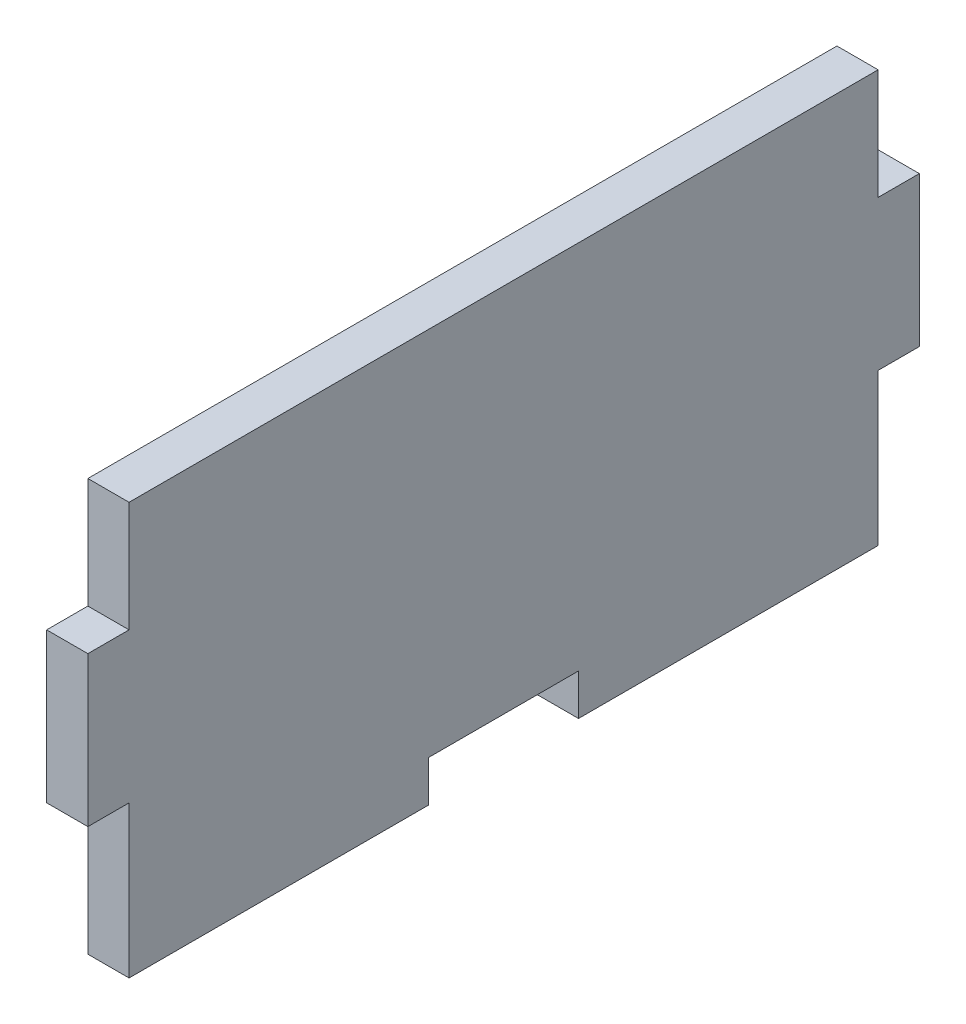
ISO-10303-21;
HEADER;
FILE_DESCRIPTION(('STEP AP214'),'2;1');
FILE_NAME('part.step','',(''),(''),'','','');
FILE_SCHEMA(('AUTOMOTIVE_DESIGN { 1 0 10303 214 1 1 1 1 }'));
ENDSEC;
DATA;
#1=APPLICATION_CONTEXT('core data for automotive mechanical design processes');
#2=APPLICATION_PROTOCOL_DEFINITION('international standard','automotive_design',2000,#1);
#3=PRODUCT_CONTEXT('',#1,'mechanical');
#4=PRODUCT('Part','Part','',(#3));
#5=PRODUCT_RELATED_PRODUCT_CATEGORY('part','',(#4));
#6=PRODUCT_DEFINITION_FORMATION('','',#4);
#7=PRODUCT_DEFINITION_CONTEXT('part definition',#1,'design');
#8=PRODUCT_DEFINITION('design','',#6,#7);
#9=PRODUCT_DEFINITION_SHAPE('','',#8);
#10=(LENGTH_UNIT() NAMED_UNIT(*) SI_UNIT(.MILLI.,.METRE.));
#11=(NAMED_UNIT(*) PLANE_ANGLE_UNIT() SI_UNIT($,.RADIAN.));
#12=(NAMED_UNIT(*) SI_UNIT($,.STERADIAN.) SOLID_ANGLE_UNIT());
#13=UNCERTAINTY_MEASURE_WITH_UNIT(LENGTH_MEASURE(1.E-05),#10,'distance_accuracy_value','');
#14=(GEOMETRIC_REPRESENTATION_CONTEXT(3) GLOBAL_UNCERTAINTY_ASSIGNED_CONTEXT((#13)) GLOBAL_UNIT_ASSIGNED_CONTEXT((#10,
#11,#12)) REPRESENTATION_CONTEXT('',''));
#15=CARTESIAN_POINT('',(0.,0.,0.));
#16=DIRECTION('',(0.,0.,1.));
#17=DIRECTION('',(1.,0.,0.));
#18=AXIS2_PLACEMENT_3D('',#15,#16,#17);
#19=CARTESIAN_POINT('',(5.5,20.2871148761308,0.));
#20=DIRECTION('',(0.,-1.,0.));
#21=DIRECTION('',(0.,0.,-1.));
#22=AXIS2_PLACEMENT_3D('',#19,#20,#21);
#23=PLANE('',#22);
#24=DIRECTION('',(0.,0.,1.));
#25=VECTOR('',#24,1.);
#26=CARTESIAN_POINT('',(0.,20.2871148761308,0.));
#27=LINE('',#26,#25);
#28=CARTESIAN_POINT('',(0.,20.2871148761308,-11.4177682654805));
#29=VERTEX_POINT('',#28);
#30=CARTESIAN_POINT('',(0.,20.2871148761308,-5.91776826547938));
#31=VERTEX_POINT('',#30);
#32=EDGE_CURVE('E189',#29,#31,#27,.T.);
#33=ORIENTED_EDGE('',*,*,#32,.F.);
#34=DIRECTION('',(-1.,0.,0.));
#35=VECTOR('',#34,1.);
#36=CARTESIAN_POINT('',(5.5,20.2871148761308,-11.4177682654805));
#37=LINE('',#36,#35);
#38=CARTESIAN_POINT('',(5.5,20.2871148761308,-11.4177682654805));
#39=VERTEX_POINT('',#38);
#40=EDGE_CURVE('E11',#39,#29,#37,.T.);
#41=ORIENTED_EDGE('',*,*,#40,.F.);
#42=DIRECTION('',(0.,0.,1.));
#43=VECTOR('',#42,1.);
#44=CARTESIAN_POINT('',(5.5,20.2871148761308,0.));
#45=LINE('',#44,#43);
#46=CARTESIAN_POINT('',(5.5,20.2871148761308,-5.91776826547938));
#47=VERTEX_POINT('',#46);
#48=EDGE_CURVE('E230',#39,#47,#45,.T.);
#49=ORIENTED_EDGE('',*,*,#48,.T.);
#50=DIRECTION('',(-1.,0.,0.));
#51=VECTOR('',#50,1.);
#52=CARTESIAN_POINT('',(5.5,20.2871148761308,-5.91776826547938));
#53=LINE('',#52,#51);
#54=EDGE_CURVE('E121',#47,#31,#53,.T.);
#55=ORIENTED_EDGE('',*,*,#54,.T.);
#56=EDGE_LOOP('',(#33,#41,#49,#55));
#57=FACE_BOUND('',#56,.T.);
#58=ADVANCED_FACE('F47',(#57),#23,.T.);
#59=CARTESIAN_POINT('',(5.5,0.,-11.4177682654805));
#60=DIRECTION('',(0.,0.,-1.));
#61=DIRECTION('',(0.,1.,0.));
#62=AXIS2_PLACEMENT_3D('',#59,#60,#61);
#63=PLANE('',#62);
#64=DIRECTION('',(0.,-1.,0.));
#65=VECTOR('',#64,1.);
#66=CARTESIAN_POINT('',(0.,0.,-11.4177682654805));
#67=LINE('',#66,#65);
#68=CARTESIAN_POINT('',(0.,0.0371148761307556,-11.4177682654805));
#69=VERTEX_POINT('',#68);
#70=EDGE_CURVE('E192',#29,#69,#67,.T.);
#71=ORIENTED_EDGE('',*,*,#70,.T.);
#72=DIRECTION('',(-1.,0.,0.));
#73=VECTOR('',#72,1.);
#74=CARTESIAN_POINT('',(5.5,0.0371148761307556,-11.4177682654805));
#75=LINE('',#74,#73);
#76=CARTESIAN_POINT('',(5.5,0.0371148761307556,-11.4177682654805));
#77=VERTEX_POINT('',#76);
#78=EDGE_CURVE('E55',#77,#69,#75,.T.);
#79=ORIENTED_EDGE('',*,*,#78,.F.);
#80=DIRECTION('',(0.,-1.,0.));
#81=VECTOR('',#80,1.);
#82=CARTESIAN_POINT('',(5.5,0.,-11.4177682654805));
#83=LINE('',#82,#81);
#84=EDGE_CURVE('E306',#39,#77,#83,.T.);
#85=ORIENTED_EDGE('',*,*,#84,.F.);
#86=ORIENTED_EDGE('',*,*,#40,.T.);
#87=EDGE_LOOP('',(#71,#79,#85,#86));
#88=FACE_BOUND('',#87,.T.);
#89=ADVANCED_FACE('F309',(#88),#63,.F.);
#90=CARTESIAN_POINT('',(5.5,0.0371148761307556,0.));
#91=DIRECTION('',(0.,1.,0.));
#92=DIRECTION('',(0.,0.,1.));
#93=AXIS2_PLACEMENT_3D('',#90,#91,#92);
#94=PLANE('',#93);
#95=DIRECTION('',(0.,0.,-1.));
#96=VECTOR('',#95,1.);
#97=CARTESIAN_POINT('',(0.,0.0371148761307556,0.));
#98=LINE('',#97,#96);
#99=CARTESIAN_POINT('',(0.,0.0371148761307556,-51.4177682654807));
#100=VERTEX_POINT('',#99);
#101=EDGE_CURVE('E194',#69,#100,#98,.T.);
#102=ORIENTED_EDGE('',*,*,#101,.T.);
#103=DIRECTION('',(-1.,0.,0.));
#104=VECTOR('',#103,1.);
#105=CARTESIAN_POINT('',(5.5,0.0371148761307556,-51.4177682654807));
#106=LINE('',#105,#104);
#107=CARTESIAN_POINT('',(5.5,0.0371148761307556,-51.4177682654807));
#108=VERTEX_POINT('',#107);
#109=EDGE_CURVE('E253',#108,#100,#106,.T.);
#110=ORIENTED_EDGE('',*,*,#109,.F.);
#111=DIRECTION('',(0.,0.,-1.));
#112=VECTOR('',#111,1.);
#113=CARTESIAN_POINT('',(5.5,0.0371148761307556,0.));
#114=LINE('',#113,#112);
#115=EDGE_CURVE('E262',#77,#108,#114,.T.);
#116=ORIENTED_EDGE('',*,*,#115,.F.);
#117=ORIENTED_EDGE('',*,*,#78,.T.);
#118=EDGE_LOOP('',(#102,#110,#116,#117));
#119=FACE_BOUND('',#118,.T.);
#120=ADVANCED_FACE('F260',(#119),#94,.F.);
#121=CARTESIAN_POINT('',(5.5,0.,-51.4177682654807));
#122=DIRECTION('',(0.,0.,1.));
#123=DIRECTION('',(1.,0.,0.));
#124=AXIS2_PLACEMENT_3D('',#121,#122,#123);
#125=PLANE('',#124);
#126=DIRECTION('',(0.,1.,0.));
#127=VECTOR('',#126,1.);
#128=CARTESIAN_POINT('',(0.,0.,-51.4177682654807));
#129=LINE('',#128,#127);
#130=CARTESIAN_POINT('',(0.,5.53711487613075,-51.4177682654807));
#131=VERTEX_POINT('',#130);
#132=EDGE_CURVE('E196',#100,#131,#129,.T.);
#133=ORIENTED_EDGE('',*,*,#132,.T.);
#134=DIRECTION('',(-1.,0.,0.));
#135=VECTOR('',#134,1.);
#136=CARTESIAN_POINT('',(5.5,5.53711487613075,-51.4177682654807));
#137=LINE('',#136,#135);
#138=CARTESIAN_POINT('',(5.5,5.53711487613075,-51.4177682654807));
#139=VERTEX_POINT('',#138);
#140=EDGE_CURVE('E250',#139,#131,#137,.T.);
#141=ORIENTED_EDGE('',*,*,#140,.F.);
#142=DIRECTION('',(0.,1.,0.));
#143=VECTOR('',#142,1.);
#144=CARTESIAN_POINT('',(5.5,0.,-51.4177682654807));
#145=LINE('',#144,#143);
#146=EDGE_CURVE('E281',#108,#139,#145,.T.);
#147=ORIENTED_EDGE('',*,*,#146,.F.);
#148=ORIENTED_EDGE('',*,*,#109,.T.);
#149=EDGE_LOOP('',(#133,#141,#147,#148));
#150=FACE_BOUND('',#149,.T.);
#151=ADVANCED_FACE('F271',(#150),#125,.F.);
#152=CARTESIAN_POINT('',(5.5,5.53711487613075,0.));
#153=DIRECTION('',(0.,1.,0.));
#154=DIRECTION('',(0.,0.,1.));
#155=AXIS2_PLACEMENT_3D('',#152,#153,#154);
#156=PLANE('',#155);
#157=DIRECTION('',(0.,0.,-1.));
#158=VECTOR('',#157,1.);
#159=CARTESIAN_POINT('',(0.,5.53711487613075,0.));
#160=LINE('',#159,#158);
#161=CARTESIAN_POINT('',(0.,5.53711487613075,-71.4177682654807));
#162=VERTEX_POINT('',#161);
#163=EDGE_CURVE('E198',#131,#162,#160,.T.);
#164=ORIENTED_EDGE('',*,*,#163,.T.);
#165=DIRECTION('',(-1.,0.,0.));
#166=VECTOR('',#165,1.);
#167=CARTESIAN_POINT('',(5.5,5.53711487613075,-71.4177682654807));
#168=LINE('',#167,#166);
#169=CARTESIAN_POINT('',(5.5,5.53711487613075,-71.4177682654807));
#170=VERTEX_POINT('',#169);
#171=EDGE_CURVE('E248',#170,#162,#168,.T.);
#172=ORIENTED_EDGE('',*,*,#171,.F.);
#173=DIRECTION('',(0.,0.,-1.));
#174=VECTOR('',#173,1.);
#175=CARTESIAN_POINT('',(5.5,5.53711487613075,0.));
#176=LINE('',#175,#174);
#177=EDGE_CURVE('E277',#139,#170,#176,.T.);
#178=ORIENTED_EDGE('',*,*,#177,.F.);
#179=ORIENTED_EDGE('',*,*,#140,.T.);
#180=EDGE_LOOP('',(#164,#172,#178,#179));
#181=FACE_BOUND('',#180,.T.);
#182=ADVANCED_FACE('F275',(#181),#156,.F.);
#183=CARTESIAN_POINT('',(5.5,0.,-71.4177682654807));
#184=DIRECTION('',(0.,0.,1.));
#185=DIRECTION('',(1.,0.,0.));
#186=AXIS2_PLACEMENT_3D('',#183,#184,#185);
#187=PLANE('',#186);
#188=DIRECTION('',(0.,1.,0.));
#189=VECTOR('',#188,1.);
#190=CARTESIAN_POINT('',(0.,0.,-71.4177682654807));
#191=LINE('',#190,#189);
#192=CARTESIAN_POINT('',(0.,0.0371148761307465,-71.4177682654807));
#193=VERTEX_POINT('',#192);
#194=EDGE_CURVE('E201',#193,#162,#191,.T.);
#195=ORIENTED_EDGE('',*,*,#194,.F.);
#196=DIRECTION('',(-1.,0.,0.));
#197=VECTOR('',#196,1.);
#198=CARTESIAN_POINT('',(5.5,0.0371148761307465,-71.4177682654807));
#199=LINE('',#198,#197);
#200=CARTESIAN_POINT('',(5.5,0.0371148761307465,-71.4177682654807));
#201=VERTEX_POINT('',#200);
#202=EDGE_CURVE('E246',#201,#193,#199,.T.);
#203=ORIENTED_EDGE('',*,*,#202,.F.);
#204=DIRECTION('',(0.,1.,0.));
#205=VECTOR('',#204,1.);
#206=CARTESIAN_POINT('',(5.5,0.,-71.4177682654807));
#207=LINE('',#206,#205);
#208=EDGE_CURVE('E280',#201,#170,#207,.T.);
#209=ORIENTED_EDGE('',*,*,#208,.T.);
#210=ORIENTED_EDGE('',*,*,#171,.T.);
#211=EDGE_LOOP('',(#195,#203,#209,#210));
#212=FACE_BOUND('',#211,.T.);
#213=ADVANCED_FACE('F322',(#212),#187,.T.);
#214=CARTESIAN_POINT('',(5.5,0.0371148761307465,0.));
#215=DIRECTION('',(0.,1.,0.));
#216=DIRECTION('',(0.,0.,1.));
#217=AXIS2_PLACEMENT_3D('',#214,#215,#216);
#218=PLANE('',#217);
#219=DIRECTION('',(0.,0.,-1.));
#220=VECTOR('',#219,1.);
#221=CARTESIAN_POINT('',(0.,0.0371148761307465,0.));
#222=LINE('',#221,#220);
#223=CARTESIAN_POINT('',(0.,0.0371148761307465,-111.417768265481));
#224=VERTEX_POINT('',#223);
#225=EDGE_CURVE('E204',#193,#224,#222,.T.);
#226=ORIENTED_EDGE('',*,*,#225,.T.);
#227=DIRECTION('',(-1.,0.,0.));
#228=VECTOR('',#227,1.);
#229=CARTESIAN_POINT('',(5.5,0.0371148761307465,-111.417768265481));
#230=LINE('',#229,#228);
#231=CARTESIAN_POINT('',(5.5,0.0371148761307465,-111.417768265481));
#232=VERTEX_POINT('',#231);
#233=EDGE_CURVE('E244',#232,#224,#230,.T.);
#234=ORIENTED_EDGE('',*,*,#233,.F.);
#235=DIRECTION('',(0.,0.,-1.));
#236=VECTOR('',#235,1.);
#237=CARTESIAN_POINT('',(5.5,0.0371148761307465,0.));
#238=LINE('',#237,#236);
#239=EDGE_CURVE('E283',#201,#232,#238,.T.);
#240=ORIENTED_EDGE('',*,*,#239,.F.);
#241=ORIENTED_EDGE('',*,*,#202,.T.);
#242=EDGE_LOOP('',(#226,#234,#240,#241));
#243=FACE_BOUND('',#242,.T.);
#244=ADVANCED_FACE('F325',(#243),#218,.F.);
#245=CARTESIAN_POINT('',(5.5,0.,-111.417768265481));
#246=DIRECTION('',(0.,0.,-1.));
#247=DIRECTION('',(-1.,0.,0.));
#248=AXIS2_PLACEMENT_3D('',#245,#246,#247);
#249=PLANE('',#248);
#250=DIRECTION('',(0.,-1.,0.));
#251=VECTOR('',#250,1.);
#252=CARTESIAN_POINT('',(0.,0.,-111.417768265481));
#253=LINE('',#252,#251);
#254=CARTESIAN_POINT('',(0.,20.2871148761308,-111.417768265481));
#255=VERTEX_POINT('',#254);
#256=EDGE_CURVE('E207',#255,#224,#253,.T.);
#257=ORIENTED_EDGE('',*,*,#256,.F.);
#258=DIRECTION('',(-1.,0.,0.));
#259=VECTOR('',#258,1.);
#260=CARTESIAN_POINT('',(5.5,20.2871148761308,-111.417768265481));
#261=LINE('',#260,#259);
#262=CARTESIAN_POINT('',(5.5,20.2871148761308,-111.417768265481));
#263=VERTEX_POINT('',#262);
#264=EDGE_CURVE('E242',#263,#255,#261,.T.);
#265=ORIENTED_EDGE('',*,*,#264,.F.);
#266=DIRECTION('',(0.,-1.,0.));
#267=VECTOR('',#266,1.);
#268=CARTESIAN_POINT('',(5.5,0.,-111.417768265481));
#269=LINE('',#268,#267);
#270=EDGE_CURVE('E289',#263,#232,#269,.T.);
#271=ORIENTED_EDGE('',*,*,#270,.T.);
#272=ORIENTED_EDGE('',*,*,#233,.T.);
#273=EDGE_LOOP('',(#257,#265,#271,#272));
#274=FACE_BOUND('',#273,.T.);
#275=ADVANCED_FACE('F329',(#274),#249,.T.);
#276=CARTESIAN_POINT('',(5.5,20.2871148761308,0.));
#277=DIRECTION('',(0.,1.,0.));
#278=DIRECTION('',(0.,0.,1.));
#279=AXIS2_PLACEMENT_3D('',#276,#277,#278);
#280=PLANE('',#279);
#281=DIRECTION('',(0.,0.,-1.));
#282=VECTOR('',#281,1.);
#283=CARTESIAN_POINT('',(0.,20.2871148761308,0.));
#284=LINE('',#283,#282);
#285=CARTESIAN_POINT('',(0.,20.2871148761308,-116.917768265482));
#286=VERTEX_POINT('',#285);
#287=EDGE_CURVE('E210',#255,#286,#284,.T.);
#288=ORIENTED_EDGE('',*,*,#287,.T.);
#289=DIRECTION('',(-1.,0.,0.));
#290=VECTOR('',#289,1.);
#291=CARTESIAN_POINT('',(5.5,20.2871148761308,-116.917768265482));
#292=LINE('',#291,#290);
#293=CARTESIAN_POINT('',(5.5,20.2871148761308,-116.917768265482));
#294=VERTEX_POINT('',#293);
#295=EDGE_CURVE('E240',#294,#286,#292,.T.);
#296=ORIENTED_EDGE('',*,*,#295,.F.);
#297=DIRECTION('',(0.,0.,-1.));
#298=VECTOR('',#297,1.);
#299=CARTESIAN_POINT('',(5.5,20.2871148761308,0.));
#300=LINE('',#299,#298);
#301=EDGE_CURVE('E292',#263,#294,#300,.T.);
#302=ORIENTED_EDGE('',*,*,#301,.F.);
#303=ORIENTED_EDGE('',*,*,#264,.T.);
#304=EDGE_LOOP('',(#288,#296,#302,#303));
#305=FACE_BOUND('',#304,.T.);
#306=ADVANCED_FACE('F333',(#305),#280,.F.);
#307=CARTESIAN_POINT('',(5.5,0.,-116.917768265482));
#308=DIRECTION('',(0.,0.,-1.));
#309=DIRECTION('',(0.,1.,0.));
#310=AXIS2_PLACEMENT_3D('',#307,#308,#309);
#311=PLANE('',#310);
#312=DIRECTION('',(0.,-1.,0.));
#313=VECTOR('',#312,1.);
#314=CARTESIAN_POINT('',(0.,0.,-116.917768265482));
#315=LINE('',#314,#313);
#316=CARTESIAN_POINT('',(0.,40.2871148761308,-116.917768265482));
#317=VERTEX_POINT('',#316);
#318=EDGE_CURVE('E213',#317,#286,#315,.T.);
#319=ORIENTED_EDGE('',*,*,#318,.F.);
#320=DIRECTION('',(-1.,0.,0.));
#321=VECTOR('',#320,1.);
#322=CARTESIAN_POINT('',(5.5,40.2871148761308,-116.917768265482));
#323=LINE('',#322,#321);
#324=CARTESIAN_POINT('',(5.5,40.2871148761308,-116.917768265482));
#325=VERTEX_POINT('',#324);
#326=EDGE_CURVE('E238',#325,#317,#323,.T.);
#327=ORIENTED_EDGE('',*,*,#326,.F.);
#328=DIRECTION('',(0.,-1.,0.));
#329=VECTOR('',#328,1.);
#330=CARTESIAN_POINT('',(5.5,0.,-116.917768265482));
#331=LINE('',#330,#329);
#332=EDGE_CURVE('E294',#325,#294,#331,.T.);
#333=ORIENTED_EDGE('',*,*,#332,.T.);
#334=ORIENTED_EDGE('',*,*,#295,.T.);
#335=EDGE_LOOP('',(#319,#327,#333,#334));
#336=FACE_BOUND('',#335,.T.);
#337=ADVANCED_FACE('F337',(#336),#311,.T.);
#338=CARTESIAN_POINT('',(5.5,40.2871148761308,0.));
#339=DIRECTION('',(0.,-1.,0.));
#340=DIRECTION('',(0.,0.,-1.));
#341=AXIS2_PLACEMENT_3D('',#338,#339,#340);
#342=PLANE('',#341);
#343=DIRECTION('',(0.,0.,1.));
#344=VECTOR('',#343,1.);
#345=CARTESIAN_POINT('',(0.,40.2871148761308,0.));
#346=LINE('',#345,#344);
#347=CARTESIAN_POINT('',(0.,40.2871148761308,-111.417768265482));
#348=VERTEX_POINT('',#347);
#349=EDGE_CURVE('E216',#317,#348,#346,.T.);
#350=ORIENTED_EDGE('',*,*,#349,.T.);
#351=DIRECTION('',(-1.,0.,0.));
#352=VECTOR('',#351,1.);
#353=CARTESIAN_POINT('',(5.5,40.2871148761308,-111.417768265482));
#354=LINE('',#353,#352);
#355=CARTESIAN_POINT('',(5.5,40.2871148761308,-111.417768265482));
#356=VERTEX_POINT('',#355);
#357=EDGE_CURVE('E236',#356,#348,#354,.T.);
#358=ORIENTED_EDGE('',*,*,#357,.F.);
#359=DIRECTION('',(0.,0.,1.));
#360=VECTOR('',#359,1.);
#361=CARTESIAN_POINT('',(5.5,40.2871148761308,0.));
#362=LINE('',#361,#360);
#363=EDGE_CURVE('E297',#325,#356,#362,.T.);
#364=ORIENTED_EDGE('',*,*,#363,.F.);
#365=ORIENTED_EDGE('',*,*,#326,.T.);
#366=EDGE_LOOP('',(#350,#358,#364,#365));
#367=FACE_BOUND('',#366,.T.);
#368=ADVANCED_FACE('F341',(#367),#342,.F.);
#369=CARTESIAN_POINT('',(5.5,0.,-111.417768265482));
#370=DIRECTION('',(0.,0.,-1.));
#371=DIRECTION('',(-1.,0.,0.));
#372=AXIS2_PLACEMENT_3D('',#369,#370,#371);
#373=PLANE('',#372);
#374=DIRECTION('',(0.,-1.,0.));
#375=VECTOR('',#374,1.);
#376=CARTESIAN_POINT('',(0.,0.,-111.417768265482));
#377=LINE('',#376,#375);
#378=CARTESIAN_POINT('',(0.,55.0371148761308,-111.417768265482));
#379=VERTEX_POINT('',#378);
#380=EDGE_CURVE('E219',#379,#348,#377,.T.);
#381=ORIENTED_EDGE('',*,*,#380,.F.);
#382=DIRECTION('',(-1.,0.,0.));
#383=VECTOR('',#382,1.);
#384=CARTESIAN_POINT('',(5.5,55.0371148761308,-111.417768265482));
#385=LINE('',#384,#383);
#386=CARTESIAN_POINT('',(5.5,55.0371148761308,-111.417768265482));
#387=VERTEX_POINT('',#386);
#388=EDGE_CURVE('E234',#387,#379,#385,.T.);
#389=ORIENTED_EDGE('',*,*,#388,.F.);
#390=DIRECTION('',(0.,-1.,0.));
#391=VECTOR('',#390,1.);
#392=CARTESIAN_POINT('',(5.5,0.,-111.417768265482));
#393=LINE('',#392,#391);
#394=EDGE_CURVE('E299',#387,#356,#393,.T.);
#395=ORIENTED_EDGE('',*,*,#394,.T.);
#396=ORIENTED_EDGE('',*,*,#357,.T.);
#397=EDGE_LOOP('',(#381,#389,#395,#396));
#398=FACE_BOUND('',#397,.T.);
#399=ADVANCED_FACE('F345',(#398),#373,.T.);
#400=CARTESIAN_POINT('',(5.5,55.0371148761308,0.));
#401=DIRECTION('',(0.,1.,0.));
#402=DIRECTION('',(0.,0.,1.));
#403=AXIS2_PLACEMENT_3D('',#400,#401,#402);
#404=PLANE('',#403);
#405=DIRECTION('',(0.,0.,-1.));
#406=VECTOR('',#405,1.);
#407=CARTESIAN_POINT('',(0.,55.0371148761308,0.));
#408=LINE('',#407,#406);
#409=CARTESIAN_POINT('',(0.,55.0371148761308,-11.4177682654794));
#410=VERTEX_POINT('',#409);
#411=EDGE_CURVE('E222',#410,#379,#408,.T.);
#412=ORIENTED_EDGE('',*,*,#411,.F.);
#413=DIRECTION('',(-1.,0.,0.));
#414=VECTOR('',#413,1.);
#415=CARTESIAN_POINT('',(5.5,55.0371148761308,-11.4177682654794));
#416=LINE('',#415,#414);
#417=CARTESIAN_POINT('',(5.5,55.0371148761308,-11.4177682654794));
#418=VERTEX_POINT('',#417);
#419=EDGE_CURVE('E175',#418,#410,#416,.T.);
#420=ORIENTED_EDGE('',*,*,#419,.F.);
#421=DIRECTION('',(0.,0.,-1.));
#422=VECTOR('',#421,1.);
#423=CARTESIAN_POINT('',(5.5,55.0371148761308,0.));
#424=LINE('',#423,#422);
#425=EDGE_CURVE('E182',#418,#387,#424,.T.);
#426=ORIENTED_EDGE('',*,*,#425,.T.);
#427=ORIENTED_EDGE('',*,*,#388,.T.);
#428=EDGE_LOOP('',(#412,#420,#426,#427));
#429=FACE_BOUND('',#428,.T.);
#430=ADVANCED_FACE('F303',(#429),#404,.T.);
#431=CARTESIAN_POINT('',(5.5,0.,-11.4177682654794));
#432=DIRECTION('',(0.,0.,1.));
#433=DIRECTION('',(1.,0.,0.));
#434=AXIS2_PLACEMENT_3D('',#431,#432,#433);
#435=PLANE('',#434);
#436=DIRECTION('',(0.,1.,0.));
#437=VECTOR('',#436,1.);
#438=CARTESIAN_POINT('',(0.,0.,-11.4177682654794));
#439=LINE('',#438,#437);
#440=CARTESIAN_POINT('',(0.,40.2871148761308,-11.4177682654794));
#441=VERTEX_POINT('',#440);
#442=EDGE_CURVE('E170',#441,#410,#439,.T.);
#443=ORIENTED_EDGE('',*,*,#442,.F.);
#444=DIRECTION('',(-1.,0.,0.));
#445=VECTOR('',#444,1.);
#446=CARTESIAN_POINT('',(5.5,40.2871148761308,-11.4177682654794));
#447=LINE('',#446,#445);
#448=CARTESIAN_POINT('',(5.5,40.2871148761308,-11.4177682654794));
#449=VERTEX_POINT('',#448);
#450=EDGE_CURVE('E165',#449,#441,#447,.T.);
#451=ORIENTED_EDGE('',*,*,#450,.F.);
#452=DIRECTION('',(0.,1.,0.));
#453=VECTOR('',#452,1.);
#454=CARTESIAN_POINT('',(5.5,0.,-11.4177682654794));
#455=LINE('',#454,#453);
#456=EDGE_CURVE('E168',#449,#418,#455,.T.);
#457=ORIENTED_EDGE('',*,*,#456,.T.);
#458=ORIENTED_EDGE('',*,*,#419,.T.);
#459=EDGE_LOOP('',(#443,#451,#457,#458));
#460=FACE_BOUND('',#459,.T.);
#461=ADVANCED_FACE('F167',(#460),#435,.T.);
#462=CARTESIAN_POINT('',(5.5,40.2871148761308,0.));
#463=DIRECTION('',(0.,1.,0.));
#464=DIRECTION('',(0.,0.,1.));
#465=AXIS2_PLACEMENT_3D('',#462,#463,#464);
#466=PLANE('',#465);
#467=DIRECTION('',(0.,0.,-1.));
#468=VECTOR('',#467,1.);
#469=CARTESIAN_POINT('',(0.,40.2871148761308,0.));
#470=LINE('',#469,#468);
#471=CARTESIAN_POINT('',(0.,40.2871148761308,-5.91776826547938));
#472=VERTEX_POINT('',#471);
#473=EDGE_CURVE('E226',#472,#441,#470,.T.);
#474=ORIENTED_EDGE('',*,*,#473,.F.);
#475=DIRECTION('',(-1.,0.,0.));
#476=VECTOR('',#475,1.);
#477=CARTESIAN_POINT('',(5.5,40.2871148761308,-5.91776826547938));
#478=LINE('',#477,#476);
#479=CARTESIAN_POINT('',(5.5,40.2871148761308,-5.91776826547938));
#480=VERTEX_POINT('',#479);
#481=EDGE_CURVE('E114',#480,#472,#478,.T.);
#482=ORIENTED_EDGE('',*,*,#481,.F.);
#483=DIRECTION('',(0.,0.,-1.));
#484=VECTOR('',#483,1.);
#485=CARTESIAN_POINT('',(5.5,40.2871148761308,0.));
#486=LINE('',#485,#484);
#487=EDGE_CURVE('E179',#480,#449,#486,.T.);
#488=ORIENTED_EDGE('',*,*,#487,.T.);
#489=ORIENTED_EDGE('',*,*,#450,.T.);
#490=EDGE_LOOP('',(#474,#482,#488,#489));
#491=FACE_BOUND('',#490,.T.);
#492=ADVANCED_FACE('F184',(#491),#466,.T.);
#493=CARTESIAN_POINT('',(5.5,0.,-5.91776826547938));
#494=DIRECTION('',(0.,0.,-1.));
#495=DIRECTION('',(0.,1.,0.));
#496=AXIS2_PLACEMENT_3D('',#493,#494,#495);
#497=PLANE('',#496);
#498=DIRECTION('',(0.,-1.,0.));
#499=VECTOR('',#498,1.);
#500=CARTESIAN_POINT('',(0.,0.,-5.91776826547938));
#501=LINE('',#500,#499);
#502=EDGE_CURVE('E228',#472,#31,#501,.T.);
#503=ORIENTED_EDGE('',*,*,#502,.T.);
#504=ORIENTED_EDGE('',*,*,#54,.F.);
#505=DIRECTION('',(0.,-1.,0.));
#506=VECTOR('',#505,1.);
#507=CARTESIAN_POINT('',(5.5,0.,-5.91776826547938));
#508=LINE('',#507,#506);
#509=EDGE_CURVE('E63',#480,#47,#508,.T.);
#510=ORIENTED_EDGE('',*,*,#509,.F.);
#511=ORIENTED_EDGE('',*,*,#481,.T.);
#512=EDGE_LOOP('',(#503,#504,#510,#511));
#513=FACE_BOUND('',#512,.T.);
#514=ADVANCED_FACE('F305',(#513),#497,.F.);
#515=CARTESIAN_POINT('',(5.5,0.,0.));
#516=DIRECTION('',(1.,0.,0.));
#517=DIRECTION('',(0.,0.,-1.));
#518=AXIS2_PLACEMENT_3D('',#515,#516,#517);
#519=PLANE('',#518);
#520=ORIENTED_EDGE('',*,*,#48,.F.);
#521=ORIENTED_EDGE('',*,*,#84,.T.);
#522=ORIENTED_EDGE('',*,*,#115,.T.);
#523=ORIENTED_EDGE('',*,*,#146,.T.);
#524=ORIENTED_EDGE('',*,*,#177,.T.);
#525=ORIENTED_EDGE('',*,*,#208,.F.);
#526=ORIENTED_EDGE('',*,*,#239,.T.);
#527=ORIENTED_EDGE('',*,*,#270,.F.);
#528=ORIENTED_EDGE('',*,*,#301,.T.);
#529=ORIENTED_EDGE('',*,*,#332,.F.);
#530=ORIENTED_EDGE('',*,*,#363,.T.);
#531=ORIENTED_EDGE('',*,*,#394,.F.);
#532=ORIENTED_EDGE('',*,*,#425,.F.);
#533=ORIENTED_EDGE('',*,*,#456,.F.);
#534=ORIENTED_EDGE('',*,*,#487,.F.);
#535=ORIENTED_EDGE('',*,*,#509,.T.);
#536=EDGE_LOOP('',(#520,#521,#522,#523,#524,#525,#526,#527,#528,#529,#530,#531,#532,#533,#534,#535));
#537=FACE_BOUND('',#536,.T.);
#538=ADVANCED_FACE('F178',(#537),#519,.T.);
#539=CARTESIAN_POINT('',(0.,0.,0.));
#540=DIRECTION('',(1.,0.,0.));
#541=DIRECTION('',(0.,0.,-1.));
#542=AXIS2_PLACEMENT_3D('',#539,#540,#541);
#543=PLANE('',#542);
#544=ORIENTED_EDGE('',*,*,#32,.T.);
#545=ORIENTED_EDGE('',*,*,#502,.F.);
#546=ORIENTED_EDGE('',*,*,#473,.T.);
#547=ORIENTED_EDGE('',*,*,#442,.T.);
#548=ORIENTED_EDGE('',*,*,#411,.T.);
#549=ORIENTED_EDGE('',*,*,#380,.T.);
#550=ORIENTED_EDGE('',*,*,#349,.F.);
#551=ORIENTED_EDGE('',*,*,#318,.T.);
#552=ORIENTED_EDGE('',*,*,#287,.F.);
#553=ORIENTED_EDGE('',*,*,#256,.T.);
#554=ORIENTED_EDGE('',*,*,#225,.F.);
#555=ORIENTED_EDGE('',*,*,#194,.T.);
#556=ORIENTED_EDGE('',*,*,#163,.F.);
#557=ORIENTED_EDGE('',*,*,#132,.F.);
#558=ORIENTED_EDGE('',*,*,#101,.F.);
#559=ORIENTED_EDGE('',*,*,#70,.F.);
#560=EDGE_LOOP('',(#544,#545,#546,#547,#548,#549,#550,#551,#552,#553,#554,#555,#556,#557,#558,#559));
#561=FACE_BOUND('',#560,.T.);
#562=ADVANCED_FACE('F267',(#561),#543,.F.);
#563=CLOSED_SHELL('',(#58,#89,#120,#151,#182,#213,#244,#275,#306,#337,#368,#399,#430,#461,#492,
#514,#538,#562));
#564=MANIFOLD_SOLID_BREP('B2',#563);
#565=ADVANCED_BREP_SHAPE_REPRESENTATION('',(#18,#564),#14);
#566=SHAPE_DEFINITION_REPRESENTATION(#9,#565);
ENDSEC;
END-ISO-10303-21;
